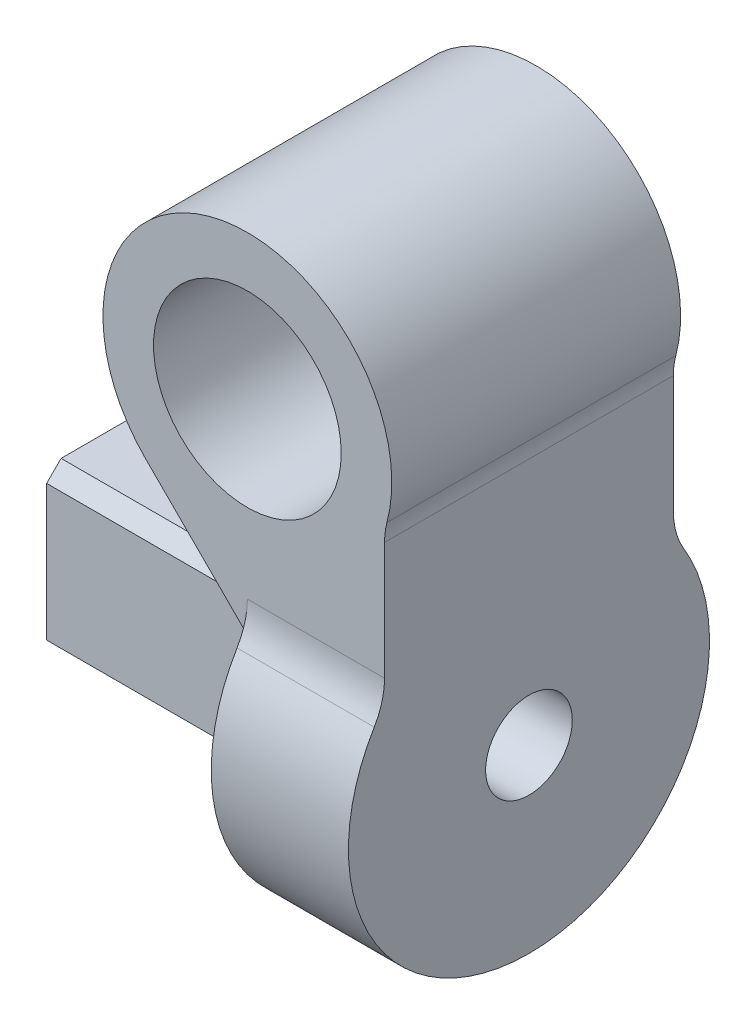
ISO-10303-21;
HEADER;
FILE_DESCRIPTION(('STEP AP214'),'2;1');
FILE_NAME('part.step','',(''),(''),'','','');
FILE_SCHEMA(('AUTOMOTIVE_DESIGN { 1 0 10303 214 1 1 1 1 }'));
ENDSEC;
DATA;
#1=APPLICATION_CONTEXT('core data for automotive mechanical design processes');
#2=APPLICATION_PROTOCOL_DEFINITION('international standard','automotive_design',2000,#1);
#3=PRODUCT_CONTEXT('',#1,'mechanical');
#4=PRODUCT('Part','Part','',(#3));
#5=PRODUCT_RELATED_PRODUCT_CATEGORY('part','',(#4));
#6=PRODUCT_DEFINITION_FORMATION('','',#4);
#7=PRODUCT_DEFINITION_CONTEXT('part definition',#1,'design');
#8=PRODUCT_DEFINITION('design','',#6,#7);
#9=PRODUCT_DEFINITION_SHAPE('','',#8);
#10=(LENGTH_UNIT() NAMED_UNIT(*) SI_UNIT(.MILLI.,.METRE.));
#11=(NAMED_UNIT(*) PLANE_ANGLE_UNIT() SI_UNIT($,.RADIAN.));
#12=(NAMED_UNIT(*) SI_UNIT($,.STERADIAN.) SOLID_ANGLE_UNIT());
#13=UNCERTAINTY_MEASURE_WITH_UNIT(LENGTH_MEASURE(1.E-05),#10,'distance_accuracy_value','');
#14=(GEOMETRIC_REPRESENTATION_CONTEXT(3) GLOBAL_UNCERTAINTY_ASSIGNED_CONTEXT((#13)) GLOBAL_UNIT_ASSIGNED_CONTEXT((#10,
#11,#12)) REPRESENTATION_CONTEXT('',''));
#15=CARTESIAN_POINT('',(0.,0.,0.));
#16=DIRECTION('',(0.,0.,1.));
#17=DIRECTION('',(1.,0.,0.));
#18=AXIS2_PLACEMENT_3D('',#15,#16,#17);
#19=CARTESIAN_POINT('',(0.,0.,0.));
#20=DIRECTION('',(1.,0.,0.));
#21=DIRECTION('',(0.,0.,-1.));
#22=AXIS2_PLACEMENT_3D('',#19,#20,#21);
#23=PLANE('',#22);
#24=CARTESIAN_POINT('',(0.,0.,0.));
#25=DIRECTION('',(1.,0.,0.));
#26=DIRECTION('',(0.,0.,-1.));
#27=AXIS2_PLACEMENT_3D('',#24,#25,#26);
#28=CIRCLE('',#27,62.5);
#29=CARTESIAN_POINT('',(0.,32.192422102357,53.5714285714286));
#30=VERTEX_POINT('',#29);
#31=CARTESIAN_POINT('',(0.,32.192422102357,-53.5714285714286));
#32=VERTEX_POINT('',#31);
#33=EDGE_CURVE('E197',#30,#32,#28,.T.);
#34=ORIENTED_EDGE('',*,*,#33,.F.);
#35=CARTESIAN_POINT('',(0.,45.0693909432998,75.));
#36=DIRECTION('',(1.,0.,0.));
#37=DIRECTION('',(0.,0.,-1.));
#38=AXIS2_PLACEMENT_3D('',#35,#36,#37);
#39=CIRCLE('',#38,25.);
#40=CARTESIAN_POINT('',(0.,45.0693909432998,50.));
#41=VERTEX_POINT('',#40);
#42=EDGE_CURVE('E237',#30,#41,#39,.T.);
#43=ORIENTED_EDGE('',*,*,#42,.T.);
#44=DIRECTION('',(0.,1.,0.));
#45=VECTOR('',#44,1.);
#46=CARTESIAN_POINT('',(0.,34.2893218813449,50.));
#47=LINE('',#46,#45);
#48=CARTESIAN_POINT('',(0.,34.2893218813449,50.));
#49=VERTEX_POINT('',#48);
#50=EDGE_CURVE('E178',#49,#41,#47,.T.);
#51=ORIENTED_EDGE('',*,*,#50,.F.);
#52=DIRECTION('',(0.,0.,-1.));
#53=VECTOR('',#52,1.);
#54=CARTESIAN_POINT('',(0.,34.2893218813449,50.));
#55=LINE('',#54,#53);
#56=CARTESIAN_POINT('',(0.,34.2893218813449,-50.));
#57=VERTEX_POINT('',#56);
#58=EDGE_CURVE('E175',#49,#57,#55,.T.);
#59=ORIENTED_EDGE('',*,*,#58,.T.);
#60=DIRECTION('',(0.,1.,0.));
#61=VECTOR('',#60,1.);
#62=CARTESIAN_POINT('',(0.,34.2893218813449,-50.));
#63=LINE('',#62,#61);
#64=CARTESIAN_POINT('',(0.,45.0693909432998,-50.));
#65=VERTEX_POINT('',#64);
#66=EDGE_CURVE('E168',#57,#65,#63,.T.);
#67=ORIENTED_EDGE('',*,*,#66,.T.);
#68=CARTESIAN_POINT('',(0.,45.0693909432998,-75.));
#69=DIRECTION('',(1.,0.,0.));
#70=DIRECTION('',(0.,0.,-1.));
#71=AXIS2_PLACEMENT_3D('',#68,#69,#70);
#72=CIRCLE('',#71,25.);
#73=EDGE_CURVE('E231',#65,#32,#72,.T.);
#74=ORIENTED_EDGE('',*,*,#73,.T.);
#75=EDGE_LOOP('',(#34,#43,#51,#59,#67,#74));
#76=FACE_BOUND('',#75,.T.);
#77=DIRECTION('',(0.,1.,0.));
#78=VECTOR('',#77,1.);
#79=CARTESIAN_POINT('',(0.,-28.5,28.5));
#80=LINE('',#79,#78);
#81=CARTESIAN_POINT('',(0.,-23.5,28.5));
#82=VERTEX_POINT('',#81);
#83=CARTESIAN_POINT('',(0.,23.5,28.5));
#84=VERTEX_POINT('',#83);
#85=EDGE_CURVE('E293',#82,#84,#80,.T.);
#86=ORIENTED_EDGE('',*,*,#85,.F.);
#87=DIRECTION('',(0.,0.707106781186546,0.707106781186549));
#88=VECTOR('',#87,1.);
#89=CARTESIAN_POINT('',(0.,-26.0000000000001,25.9999999999999));
#90=LINE('',#89,#88);
#91=CARTESIAN_POINT('',(0.,-28.5,23.5));
#92=VERTEX_POINT('',#91);
#93=EDGE_CURVE('E285',#82,#92,#90,.F.);
#94=ORIENTED_EDGE('',*,*,#93,.T.);
#95=DIRECTION('',(0.,0.,1.));
#96=VECTOR('',#95,1.);
#97=CARTESIAN_POINT('',(0.,-28.5,-28.5));
#98=LINE('',#97,#96);
#99=CARTESIAN_POINT('',(0.,-28.5,-23.5));
#100=VERTEX_POINT('',#99);
#101=EDGE_CURVE('E323',#100,#92,#98,.T.);
#102=ORIENTED_EDGE('',*,*,#101,.F.);
#103=DIRECTION('',(0.,-0.707106781186549,0.707106781186546));
#104=VECTOR('',#103,1.);
#105=CARTESIAN_POINT('',(0.,-25.9999999999999,-26.0000000000001));
#106=LINE('',#105,#104);
#107=CARTESIAN_POINT('',(0.,-23.5,-28.5));
#108=VERTEX_POINT('',#107);
#109=EDGE_CURVE('E288',#100,#108,#106,.F.);
#110=ORIENTED_EDGE('',*,*,#109,.T.);
#111=DIRECTION('',(0.,-1.,0.));
#112=VECTOR('',#111,1.);
#113=CARTESIAN_POINT('',(0.,-28.5,-28.5));
#114=LINE('',#113,#112);
#115=CARTESIAN_POINT('',(0.,23.5,-28.5));
#116=VERTEX_POINT('',#115);
#117=EDGE_CURVE('E331',#116,#108,#114,.T.);
#118=ORIENTED_EDGE('',*,*,#117,.F.);
#119=DIRECTION('',(0.,-0.707106781186546,-0.707106781186549));
#120=VECTOR('',#119,1.);
#121=CARTESIAN_POINT('',(0.,26.0000000000001,-25.9999999999999));
#122=LINE('',#121,#120);
#123=CARTESIAN_POINT('',(0.,28.5,-23.5));
#124=VERTEX_POINT('',#123);
#125=EDGE_CURVE('E11',#116,#124,#122,.F.);
#126=ORIENTED_EDGE('',*,*,#125,.T.);
#127=DIRECTION('',(0.,0.,-1.));
#128=VECTOR('',#127,1.);
#129=CARTESIAN_POINT('',(0.,28.5,-28.5));
#130=LINE('',#129,#128);
#131=CARTESIAN_POINT('',(0.,28.5,23.5));
#132=VERTEX_POINT('',#131);
#133=EDGE_CURVE('E294',#132,#124,#130,.T.);
#134=ORIENTED_EDGE('',*,*,#133,.F.);
#135=DIRECTION('',(0.,0.707106781186549,-0.707106781186546));
#136=VECTOR('',#135,1.);
#137=CARTESIAN_POINT('',(0.,25.9999999999999,26.0000000000001));
#138=LINE('',#137,#136);
#139=EDGE_CURVE('E53',#132,#84,#138,.F.);
#140=ORIENTED_EDGE('',*,*,#139,.T.);
#141=EDGE_LOOP('',(#86,#94,#102,#110,#118,#126,#134,#140));
#142=FACE_BOUND('',#141,.T.);
#143=ADVANCED_FACE('F43',(#76,#142),#23,.F.);
#144=CARTESIAN_POINT('',(47.5,0.,0.));
#145=DIRECTION('',(-1.,0.,0.));
#146=DIRECTION('',(0.,0.,1.));
#147=AXIS2_PLACEMENT_3D('',#144,#145,#146);
#148=CYLINDRICAL_SURFACE('',#147,62.5);
#149=ORIENTED_EDGE('',*,*,#33,.T.);
#150=DIRECTION('',(-1.,0.,0.));
#151=VECTOR('',#150,1.);
#152=CARTESIAN_POINT('',(47.5,32.192422102357,-53.5714285714286));
#153=LINE('',#152,#151);
#154=CARTESIAN_POINT('',(47.5,32.192422102357,-53.5714285714286));
#155=VERTEX_POINT('',#154);
#156=EDGE_CURVE('E209',#32,#155,#153,.F.);
#157=ORIENTED_EDGE('',*,*,#156,.T.);
#158=CARTESIAN_POINT('',(47.5,0.,0.));
#159=DIRECTION('',(1.,0.,0.));
#160=DIRECTION('',(0.,0.,-1.));
#161=AXIS2_PLACEMENT_3D('',#158,#159,#160);
#162=CIRCLE('',#161,62.5);
#163=CARTESIAN_POINT('',(47.5,32.192422102357,53.5714285714286));
#164=VERTEX_POINT('',#163);
#165=EDGE_CURVE('E199',#164,#155,#162,.T.);
#166=ORIENTED_EDGE('',*,*,#165,.F.);
#167=DIRECTION('',(-1.,0.,0.));
#168=VECTOR('',#167,1.);
#169=CARTESIAN_POINT('',(47.5,32.192422102357,53.5714285714286));
#170=LINE('',#169,#168);
#171=EDGE_CURVE('E203',#164,#30,#170,.T.);
#172=ORIENTED_EDGE('',*,*,#171,.T.);
#173=EDGE_LOOP('',(#149,#157,#166,#172));
#174=FACE_BOUND('',#173,.T.);
#175=ADVANCED_FACE('F374',(#174),#148,.T.);
#176=CARTESIAN_POINT('',(47.5,0.,0.));
#177=DIRECTION('',(1.,0.,0.));
#178=DIRECTION('',(0.,0.,-1.));
#179=AXIS2_PLACEMENT_3D('',#176,#177,#178);
#180=PLANE('',#179);
#181=DIRECTION('',(0.,1.,0.));
#182=VECTOR('',#181,1.);
#183=CARTESIAN_POINT('',(47.5,62.5,-50.));
#184=LINE('',#183,#182);
#185=CARTESIAN_POINT('',(47.5,45.0693909432998,-50.));
#186=VERTEX_POINT('',#185);
#187=CARTESIAN_POINT('',(47.5,85.7971356303285,-50.));
#188=VERTEX_POINT('',#187);
#189=EDGE_CURVE('E341',#186,#188,#184,.T.);
#190=ORIENTED_EDGE('',*,*,#189,.T.);
#191=DIRECTION('',(0.,0.,-1.));
#192=VECTOR('',#191,1.);
#193=CARTESIAN_POINT('',(47.5,85.7971356303285,0.));
#194=LINE('',#193,#192);
#195=CARTESIAN_POINT('',(47.5,85.7971356303285,50.));
#196=VERTEX_POINT('',#195);
#197=EDGE_CURVE('E221',#188,#196,#194,.F.);
#198=ORIENTED_EDGE('',*,*,#197,.T.);
#199=DIRECTION('',(0.,-1.,0.));
#200=VECTOR('',#199,1.);
#201=CARTESIAN_POINT('',(47.5,55.,50.));
#202=LINE('',#201,#200);
#203=CARTESIAN_POINT('',(47.5,45.0693909432998,50.));
#204=VERTEX_POINT('',#203);
#205=EDGE_CURVE('E327',#196,#204,#202,.T.);
#206=ORIENTED_EDGE('',*,*,#205,.T.);
#207=CARTESIAN_POINT('',(47.5,45.0693909432998,75.));
#208=DIRECTION('',(1.,0.,0.));
#209=DIRECTION('',(0.,0.,-1.));
#210=AXIS2_PLACEMENT_3D('',#207,#208,#209);
#211=CIRCLE('',#210,25.);
#212=EDGE_CURVE('E234',#204,#164,#211,.F.);
#213=ORIENTED_EDGE('',*,*,#212,.T.);
#214=ORIENTED_EDGE('',*,*,#165,.T.);
#215=CARTESIAN_POINT('',(47.5,45.0693909432998,-75.));
#216=DIRECTION('',(1.,0.,0.));
#217=DIRECTION('',(0.,0.,-1.));
#218=AXIS2_PLACEMENT_3D('',#215,#216,#217);
#219=CIRCLE('',#218,25.);
#220=EDGE_CURVE('E228',#155,#186,#219,.F.);
#221=ORIENTED_EDGE('',*,*,#220,.T.);
#222=EDGE_LOOP('',(#190,#198,#206,#213,#214,#221));
#223=FACE_BOUND('',#222,.T.);
#224=CARTESIAN_POINT('',(47.5,0.,0.));
#225=DIRECTION('',(1.,0.,0.));
#226=DIRECTION('',(0.,0.,-1.));
#227=AXIS2_PLACEMENT_3D('',#224,#225,#226);
#228=CIRCLE('',#227,15.);
#229=CARTESIAN_POINT('',(47.5,0.,-15.));
#230=VERTEX_POINT('',#229);
#231=EDGE_CURVE('E190',#230,#230,#228,.T.);
#232=ORIENTED_EDGE('',*,*,#231,.F.);
#233=EDGE_LOOP('',(#232));
#234=FACE_BOUND('',#233,.T.);
#235=ADVANCED_FACE('F377',(#223,#234),#180,.T.);
#236=CARTESIAN_POINT('',(47.5,0.,0.));
#237=DIRECTION('',(-1.,0.,0.));
#238=DIRECTION('',(0.,0.,1.));
#239=AXIS2_PLACEMENT_3D('',#236,#237,#238);
#240=CYLINDRICAL_SURFACE('',#239,15.);
#241=ORIENTED_EDGE('',*,*,#231,.T.);
#242=EDGE_LOOP('',(#241));
#243=FACE_BOUND('',#242,.T.);
#244=CARTESIAN_POINT('',(0.,0.,0.));
#245=DIRECTION('',(1.,0.,0.));
#246=DIRECTION('',(0.,0.,-1.));
#247=AXIS2_PLACEMENT_3D('',#244,#245,#246);
#248=CIRCLE('',#247,15.);
#249=CARTESIAN_POINT('',(0.,0.,-15.));
#250=VERTEX_POINT('',#249);
#251=EDGE_CURVE('E185',#250,#250,#248,.T.);
#252=ORIENTED_EDGE('',*,*,#251,.F.);
#253=EDGE_LOOP('',(#252));
#254=FACE_BOUND('',#253,.T.);
#255=ADVANCED_FACE('F406',(#243,#254),#240,.F.);
#256=CARTESIAN_POINT('',(0.,105.,50.));
#257=DIRECTION('',(0.,0.,-1.));
#258=DIRECTION('',(-1.,0.,0.));
#259=AXIS2_PLACEMENT_3D('',#256,#257,#258);
#260=CYLINDRICAL_SURFACE('',#259,50.);
#261=CARTESIAN_POINT('',(0.,105.,50.));
#262=DIRECTION('',(0.,0.,1.));
#263=DIRECTION('',(1.,0.,0.));
#264=AXIS2_PLACEMENT_3D('',#261,#262,#263);
#265=CIRCLE('',#264,50.);
#266=CARTESIAN_POINT('',(48.3333333333333,92.198090420219,50.));
#267=VERTEX_POINT('',#266);
#268=CARTESIAN_POINT('',(-35.3553390593276,69.6446609406728,50.));
#269=VERTEX_POINT('',#268);
#270=EDGE_CURVE('E156',#267,#269,#265,.T.);
#271=ORIENTED_EDGE('',*,*,#270,.F.);
#272=DIRECTION('',(0.,0.,-1.));
#273=VECTOR('',#272,1.);
#274=CARTESIAN_POINT('',(48.3333333333333,92.198090420219,50.));
#275=LINE('',#274,#273);
#276=CARTESIAN_POINT('',(48.3333333333333,92.198090420219,-50.));
#277=VERTEX_POINT('',#276);
#278=EDGE_CURVE('E225',#267,#277,#275,.T.);
#279=ORIENTED_EDGE('',*,*,#278,.T.);
#280=CARTESIAN_POINT('',(0.,105.,-50.));
#281=DIRECTION('',(0.,0.,1.));
#282=DIRECTION('',(1.,0.,0.));
#283=AXIS2_PLACEMENT_3D('',#280,#281,#282);
#284=CIRCLE('',#283,50.);
#285=CARTESIAN_POINT('',(-35.3553390593276,69.6446609406728,-50.));
#286=VERTEX_POINT('',#285);
#287=EDGE_CURVE('E182',#277,#286,#284,.T.);
#288=ORIENTED_EDGE('',*,*,#287,.T.);
#289=DIRECTION('',(0.,0.,-1.));
#290=VECTOR('',#289,1.);
#291=CARTESIAN_POINT('',(-35.3553390593276,69.6446609406728,50.));
#292=LINE('',#291,#290);
#293=EDGE_CURVE('E173',#269,#286,#292,.T.);
#294=ORIENTED_EDGE('',*,*,#293,.F.);
#295=EDGE_LOOP('',(#271,#279,#288,#294));
#296=FACE_BOUND('',#295,.T.);
#297=ADVANCED_FACE('F180',(#296),#260,.T.);
#298=CARTESIAN_POINT('',(0.,105.,50.));
#299=DIRECTION('',(0.,0.,1.));
#300=DIRECTION('',(1.,0.,0.));
#301=AXIS2_PLACEMENT_3D('',#298,#299,#300);
#302=PLANE('',#301);
#303=ORIENTED_EDGE('',*,*,#50,.T.);
#304=DIRECTION('',(-1.,0.,0.));
#305=VECTOR('',#304,1.);
#306=CARTESIAN_POINT('',(0.,45.0693909432998,50.));
#307=LINE('',#306,#305);
#308=EDGE_CURVE('E217',#41,#204,#307,.F.);
#309=ORIENTED_EDGE('',*,*,#308,.T.);
#310=ORIENTED_EDGE('',*,*,#205,.F.);
#311=CARTESIAN_POINT('',(72.5,85.7971356303285,50.));
#312=DIRECTION('',(0.,0.,1.));
#313=DIRECTION('',(1.,0.,0.));
#314=AXIS2_PLACEMENT_3D('',#311,#312,#313);
#315=CIRCLE('',#314,25.);
#316=EDGE_CURVE('E163',#196,#267,#315,.F.);
#317=ORIENTED_EDGE('',*,*,#316,.T.);
#318=ORIENTED_EDGE('',*,*,#270,.T.);
#319=DIRECTION('',(0.707106781186544,-0.707106781186551,0.));
#320=VECTOR('',#319,1.);
#321=CARTESIAN_POINT('',(-35.3553390593276,69.6446609406728,50.));
#322=LINE('',#321,#320);
#323=EDGE_CURVE('E160',#269,#49,#322,.T.);
#324=ORIENTED_EDGE('',*,*,#323,.T.);
#325=EDGE_LOOP('',(#303,#309,#310,#317,#318,#324));
#326=FACE_BOUND('',#325,.T.);
#327=CARTESIAN_POINT('',(0.,105.,50.));
#328=DIRECTION('',(0.,0.,1.));
#329=DIRECTION('',(1.,0.,0.));
#330=AXIS2_PLACEMENT_3D('',#327,#328,#329);
#331=CIRCLE('',#330,32.5);
#332=CARTESIAN_POINT('',(32.5,105.,50.));
#333=VERTEX_POINT('',#332);
#334=EDGE_CURVE('E346',#333,#333,#331,.T.);
#335=ORIENTED_EDGE('',*,*,#334,.F.);
#336=EDGE_LOOP('',(#335));
#337=FACE_BOUND('',#336,.T.);
#338=ADVANCED_FACE('F158',(#326,#337),#302,.T.);
#339=CARTESIAN_POINT('',(0.,105.,-50.));
#340=DIRECTION('',(0.,0.,1.));
#341=DIRECTION('',(1.,0.,0.));
#342=AXIS2_PLACEMENT_3D('',#339,#340,#341);
#343=PLANE('',#342);
#344=ORIENTED_EDGE('',*,*,#189,.F.);
#345=DIRECTION('',(1.,0.,0.));
#346=VECTOR('',#345,1.);
#347=CARTESIAN_POINT('',(0.,45.0693909432998,-50.));
#348=LINE('',#347,#346);
#349=EDGE_CURVE('E213',#186,#65,#348,.F.);
#350=ORIENTED_EDGE('',*,*,#349,.T.);
#351=ORIENTED_EDGE('',*,*,#66,.F.);
#352=DIRECTION('',(0.707106781186544,-0.707106781186551,0.));
#353=VECTOR('',#352,1.);
#354=CARTESIAN_POINT('',(-35.3553390593276,69.6446609406728,-50.));
#355=LINE('',#354,#353);
#356=EDGE_CURVE('E357',#286,#57,#355,.T.);
#357=ORIENTED_EDGE('',*,*,#356,.F.);
#358=ORIENTED_EDGE('',*,*,#287,.F.);
#359=CARTESIAN_POINT('',(72.5,85.7971356303285,-50.));
#360=DIRECTION('',(0.,0.,1.));
#361=DIRECTION('',(1.,0.,0.));
#362=AXIS2_PLACEMENT_3D('',#359,#360,#361);
#363=CIRCLE('',#362,25.);
#364=EDGE_CURVE('E243',#277,#188,#363,.T.);
#365=ORIENTED_EDGE('',*,*,#364,.T.);
#366=EDGE_LOOP('',(#344,#350,#351,#357,#358,#365));
#367=FACE_BOUND('',#366,.T.);
#368=CARTESIAN_POINT('',(0.,105.,-50.));
#369=DIRECTION('',(0.,0.,1.));
#370=DIRECTION('',(1.,0.,0.));
#371=AXIS2_PLACEMENT_3D('',#368,#369,#370);
#372=CIRCLE('',#371,32.5);
#373=CARTESIAN_POINT('',(32.5,105.,-50.));
#374=VERTEX_POINT('',#373);
#375=EDGE_CURVE('E345',#374,#374,#372,.T.);
#376=ORIENTED_EDGE('',*,*,#375,.T.);
#377=EDGE_LOOP('',(#376));
#378=FACE_BOUND('',#377,.T.);
#379=ADVANCED_FACE('F367',(#367,#378),#343,.F.);
#380=CARTESIAN_POINT('',(-35.3553390593276,69.6446609406728,50.));
#381=DIRECTION('',(0.707106781186551,0.707106781186544,0.));
#382=DIRECTION('',(-0.707106781186544,0.707106781186551,0.));
#383=AXIS2_PLACEMENT_3D('',#380,#381,#382);
#384=PLANE('',#383);
#385=ORIENTED_EDGE('',*,*,#356,.T.);
#386=ORIENTED_EDGE('',*,*,#58,.F.);
#387=ORIENTED_EDGE('',*,*,#323,.F.);
#388=ORIENTED_EDGE('',*,*,#293,.T.);
#389=EDGE_LOOP('',(#385,#386,#387,#388));
#390=FACE_BOUND('',#389,.T.);
#391=ADVANCED_FACE('F172',(#390),#384,.F.);
#392=CARTESIAN_POINT('',(0.,105.,50.));
#393=DIRECTION('',(0.,0.,-1.));
#394=DIRECTION('',(-1.,0.,0.));
#395=AXIS2_PLACEMENT_3D('',#392,#393,#394);
#396=CYLINDRICAL_SURFACE('',#395,32.5);
#397=ORIENTED_EDGE('',*,*,#334,.T.);
#398=EDGE_LOOP('',(#397));
#399=FACE_BOUND('',#398,.T.);
#400=ORIENTED_EDGE('',*,*,#375,.F.);
#401=EDGE_LOOP('',(#400));
#402=FACE_BOUND('',#401,.T.);
#403=ADVANCED_FACE('F393',(#399,#402),#396,.F.);
#404=CARTESIAN_POINT('',(47.5,45.0693909432998,-75.));
#405=DIRECTION('',(-1.,0.,0.));
#406=DIRECTION('',(0.,0.,1.));
#407=AXIS2_PLACEMENT_3D('',#404,#405,#406);
#408=CYLINDRICAL_SURFACE('',#407,25.);
#409=ORIENTED_EDGE('',*,*,#73,.F.);
#410=ORIENTED_EDGE('',*,*,#349,.F.);
#411=ORIENTED_EDGE('',*,*,#220,.F.);
#412=ORIENTED_EDGE('',*,*,#156,.F.);
#413=EDGE_LOOP('',(#409,#410,#411,#412));
#414=FACE_BOUND('',#413,.T.);
#415=ADVANCED_FACE('F371',(#414),#408,.F.);
#416=CARTESIAN_POINT('',(47.5,45.0693909432998,75.));
#417=DIRECTION('',(-1.,0.,0.));
#418=DIRECTION('',(0.,0.,1.));
#419=AXIS2_PLACEMENT_3D('',#416,#417,#418);
#420=CYLINDRICAL_SURFACE('',#419,25.);
#421=ORIENTED_EDGE('',*,*,#42,.F.);
#422=ORIENTED_EDGE('',*,*,#171,.F.);
#423=ORIENTED_EDGE('',*,*,#212,.F.);
#424=ORIENTED_EDGE('',*,*,#308,.F.);
#425=EDGE_LOOP('',(#421,#422,#423,#424));
#426=FACE_BOUND('',#425,.T.);
#427=ADVANCED_FACE('F382',(#426),#420,.F.);
#428=CARTESIAN_POINT('',(72.5,85.7971356303285,50.));
#429=DIRECTION('',(0.,0.,-1.));
#430=DIRECTION('',(-1.,0.,0.));
#431=AXIS2_PLACEMENT_3D('',#428,#429,#430);
#432=CYLINDRICAL_SURFACE('',#431,25.);
#433=ORIENTED_EDGE('',*,*,#364,.F.);
#434=ORIENTED_EDGE('',*,*,#278,.F.);
#435=ORIENTED_EDGE('',*,*,#316,.F.);
#436=ORIENTED_EDGE('',*,*,#197,.F.);
#437=EDGE_LOOP('',(#433,#434,#435,#436));
#438=FACE_BOUND('',#437,.T.);
#439=ADVANCED_FACE('F384',(#438),#432,.F.);
#440=CARTESIAN_POINT('',(0.,0.,0.));
#441=DIRECTION('',(1.,0.,0.));
#442=DIRECTION('',(0.,0.,-1.));
#443=AXIS2_PLACEMENT_3D('',#440,#441,#442);
#444=PLANE('',#443);
#445=ORIENTED_EDGE('',*,*,#251,.T.);
#446=EDGE_LOOP('',(#445));
#447=FACE_BOUND('',#446,.T.);
#448=ADVANCED_FACE('F390',(#447),#444,.T.);
#449=CARTESIAN_POINT('',(-91.,-28.5,28.5));
#450=DIRECTION('',(0.,0.,-1.));
#451=DIRECTION('',(-1.,0.,0.));
#452=AXIS2_PLACEMENT_3D('',#449,#450,#451);
#453=PLANE('',#452);
#454=DIRECTION('',(0.,1.,0.));
#455=VECTOR('',#454,1.);
#456=CARTESIAN_POINT('',(-91.,-28.5,28.5));
#457=LINE('',#456,#455);
#458=CARTESIAN_POINT('',(-91.,-23.5,28.5));
#459=VERTEX_POINT('',#458);
#460=CARTESIAN_POINT('',(-91.,23.5,28.5));
#461=VERTEX_POINT('',#460);
#462=EDGE_CURVE('E311',#459,#461,#457,.T.);
#463=ORIENTED_EDGE('',*,*,#462,.F.);
#464=DIRECTION('',(1.,0.,0.));
#465=VECTOR('',#464,1.);
#466=CARTESIAN_POINT('',(-91.,-23.5,28.5));
#467=LINE('',#466,#465);
#468=EDGE_CURVE('E249',#459,#82,#467,.T.);
#469=ORIENTED_EDGE('',*,*,#468,.T.);
#470=ORIENTED_EDGE('',*,*,#85,.T.);
#471=DIRECTION('',(-1.,0.,0.));
#472=VECTOR('',#471,1.);
#473=CARTESIAN_POINT('',(-91.,23.5,28.5));
#474=LINE('',#473,#472);
#475=EDGE_CURVE('E246',#84,#461,#474,.T.);
#476=ORIENTED_EDGE('',*,*,#475,.T.);
#477=EDGE_LOOP('',(#463,#469,#470,#476));
#478=FACE_BOUND('',#477,.T.);
#479=ADVANCED_FACE('F297',(#478),#453,.F.);
#480=CARTESIAN_POINT('',(-91.,28.5,-28.5));
#481=DIRECTION('',(0.,-1.,0.));
#482=DIRECTION('',(0.,0.,-1.));
#483=AXIS2_PLACEMENT_3D('',#480,#481,#482);
#484=PLANE('',#483);
#485=DIRECTION('',(0.,0.,-1.));
#486=VECTOR('',#485,1.);
#487=CARTESIAN_POINT('',(-91.,28.5,-28.5));
#488=LINE('',#487,#486);
#489=CARTESIAN_POINT('',(-91.,28.5,23.5));
#490=VERTEX_POINT('',#489);
#491=CARTESIAN_POINT('',(-91.,28.5,-23.5));
#492=VERTEX_POINT('',#491);
#493=EDGE_CURVE('E309',#490,#492,#488,.T.);
#494=ORIENTED_EDGE('',*,*,#493,.F.);
#495=DIRECTION('',(1.,0.,0.));
#496=VECTOR('',#495,1.);
#497=CARTESIAN_POINT('',(-91.,28.5,23.5));
#498=LINE('',#497,#496);
#499=EDGE_CURVE('E282',#490,#132,#498,.T.);
#500=ORIENTED_EDGE('',*,*,#499,.T.);
#501=ORIENTED_EDGE('',*,*,#133,.T.);
#502=DIRECTION('',(-1.,0.,0.));
#503=VECTOR('',#502,1.);
#504=CARTESIAN_POINT('',(-91.,28.5,-23.5));
#505=LINE('',#504,#503);
#506=EDGE_CURVE('E279',#124,#492,#505,.T.);
#507=ORIENTED_EDGE('',*,*,#506,.T.);
#508=EDGE_LOOP('',(#494,#500,#501,#507));
#509=FACE_BOUND('',#508,.T.);
#510=ADVANCED_FACE('F313',(#509),#484,.F.);
#511=CARTESIAN_POINT('',(-91.,-28.5,-28.5));
#512=DIRECTION('',(0.,0.,1.));
#513=DIRECTION('',(1.,0.,0.));
#514=AXIS2_PLACEMENT_3D('',#511,#512,#513);
#515=PLANE('',#514);
#516=ORIENTED_EDGE('',*,*,#117,.T.);
#517=DIRECTION('',(-1.,0.,0.));
#518=VECTOR('',#517,1.);
#519=CARTESIAN_POINT('',(-91.,-23.5,-28.5));
#520=LINE('',#519,#518);
#521=CARTESIAN_POINT('',(-91.,-23.5,-28.5));
#522=VERTEX_POINT('',#521);
#523=EDGE_CURVE('E276',#108,#522,#520,.T.);
#524=ORIENTED_EDGE('',*,*,#523,.T.);
#525=DIRECTION('',(0.,-1.,0.));
#526=VECTOR('',#525,1.);
#527=CARTESIAN_POINT('',(-91.,-28.5,-28.5));
#528=LINE('',#527,#526);
#529=CARTESIAN_POINT('',(-91.,23.5,-28.5));
#530=VERTEX_POINT('',#529);
#531=EDGE_CURVE('E316',#530,#522,#528,.T.);
#532=ORIENTED_EDGE('',*,*,#531,.F.);
#533=DIRECTION('',(1.,0.,0.));
#534=VECTOR('',#533,1.);
#535=CARTESIAN_POINT('',(-91.,23.5,-28.5));
#536=LINE('',#535,#534);
#537=EDGE_CURVE('E272',#530,#116,#536,.T.);
#538=ORIENTED_EDGE('',*,*,#537,.T.);
#539=EDGE_LOOP('',(#516,#524,#532,#538));
#540=FACE_BOUND('',#539,.T.);
#541=ADVANCED_FACE('F425',(#540),#515,.F.);
#542=CARTESIAN_POINT('',(-91.,-28.5,-28.5));
#543=DIRECTION('',(0.,1.,0.));
#544=DIRECTION('',(0.,0.,1.));
#545=AXIS2_PLACEMENT_3D('',#542,#543,#544);
#546=PLANE('',#545);
#547=ORIENTED_EDGE('',*,*,#101,.T.);
#548=DIRECTION('',(-1.,0.,0.));
#549=VECTOR('',#548,1.);
#550=CARTESIAN_POINT('',(-91.,-28.5,23.5));
#551=LINE('',#550,#549);
#552=CARTESIAN_POINT('',(-91.,-28.5,23.5));
#553=VERTEX_POINT('',#552);
#554=EDGE_CURVE('E257',#92,#553,#551,.T.);
#555=ORIENTED_EDGE('',*,*,#554,.T.);
#556=DIRECTION('',(0.,0.,1.));
#557=VECTOR('',#556,1.);
#558=CARTESIAN_POINT('',(-91.,-28.5,-28.5));
#559=LINE('',#558,#557);
#560=CARTESIAN_POINT('',(-91.,-28.5,-23.5));
#561=VERTEX_POINT('',#560);
#562=EDGE_CURVE('E321',#561,#553,#559,.T.);
#563=ORIENTED_EDGE('',*,*,#562,.F.);
#564=DIRECTION('',(1.,0.,0.));
#565=VECTOR('',#564,1.);
#566=CARTESIAN_POINT('',(-91.,-28.5,-23.5));
#567=LINE('',#566,#565);
#568=EDGE_CURVE('E253',#561,#100,#567,.T.);
#569=ORIENTED_EDGE('',*,*,#568,.T.);
#570=EDGE_LOOP('',(#547,#555,#563,#569));
#571=FACE_BOUND('',#570,.T.);
#572=ADVANCED_FACE('F428',(#571),#546,.F.);
#573=CARTESIAN_POINT('',(-91.,0.,0.));
#574=DIRECTION('',(1.,0.,0.));
#575=DIRECTION('',(0.,0.,-1.));
#576=AXIS2_PLACEMENT_3D('',#573,#574,#575);
#577=PLANE('',#576);
#578=ORIENTED_EDGE('',*,*,#562,.T.);
#579=DIRECTION('',(0.,-0.707106781186546,-0.707106781186549));
#580=VECTOR('',#579,1.);
#581=CARTESIAN_POINT('',(-91.,-23.5,28.5));
#582=LINE('',#581,#580);
#583=EDGE_CURVE('E269',#553,#459,#582,.F.);
#584=ORIENTED_EDGE('',*,*,#583,.T.);
#585=ORIENTED_EDGE('',*,*,#462,.T.);
#586=DIRECTION('',(0.,-0.707106781186549,0.707106781186546));
#587=VECTOR('',#586,1.);
#588=CARTESIAN_POINT('',(-91.,28.5,23.5));
#589=LINE('',#588,#587);
#590=EDGE_CURVE('E263',#461,#490,#589,.F.);
#591=ORIENTED_EDGE('',*,*,#590,.T.);
#592=ORIENTED_EDGE('',*,*,#493,.T.);
#593=DIRECTION('',(0.,0.707106781186546,0.707106781186549));
#594=VECTOR('',#593,1.);
#595=CARTESIAN_POINT('',(-91.,23.5,-28.5));
#596=LINE('',#595,#594);
#597=EDGE_CURVE('E260',#492,#530,#596,.F.);
#598=ORIENTED_EDGE('',*,*,#597,.T.);
#599=ORIENTED_EDGE('',*,*,#531,.T.);
#600=DIRECTION('',(0.,0.707106781186549,-0.707106781186546));
#601=VECTOR('',#600,1.);
#602=CARTESIAN_POINT('',(-91.,-28.5,-23.5));
#603=LINE('',#602,#601);
#604=EDGE_CURVE('E266',#522,#561,#603,.F.);
#605=ORIENTED_EDGE('',*,*,#604,.T.);
#606=EDGE_LOOP('',(#578,#584,#585,#591,#592,#598,#599,#605));
#607=FACE_BOUND('',#606,.T.);
#608=ADVANCED_FACE('F308',(#607),#577,.F.);
#609=CARTESIAN_POINT('',(-91.,-23.5,28.5));
#610=DIRECTION('',(0.,0.707106781186549,-0.707106781186546));
#611=DIRECTION('',(1.,0.,0.));
#612=AXIS2_PLACEMENT_3D('',#609,#610,#611);
#613=PLANE('',#612);
#614=ORIENTED_EDGE('',*,*,#583,.F.);
#615=ORIENTED_EDGE('',*,*,#554,.F.);
#616=ORIENTED_EDGE('',*,*,#93,.F.);
#617=ORIENTED_EDGE('',*,*,#468,.F.);
#618=EDGE_LOOP('',(#614,#615,#616,#617));
#619=FACE_BOUND('',#618,.T.);
#620=ADVANCED_FACE('F437',(#619),#613,.F.);
#621=CARTESIAN_POINT('',(-91.,-28.5,-23.5));
#622=DIRECTION('',(0.,0.707106781186546,0.707106781186549));
#623=DIRECTION('',(1.,0.,0.));
#624=AXIS2_PLACEMENT_3D('',#621,#622,#623);
#625=PLANE('',#624);
#626=ORIENTED_EDGE('',*,*,#604,.F.);
#627=ORIENTED_EDGE('',*,*,#523,.F.);
#628=ORIENTED_EDGE('',*,*,#109,.F.);
#629=ORIENTED_EDGE('',*,*,#568,.F.);
#630=EDGE_LOOP('',(#626,#627,#628,#629));
#631=FACE_BOUND('',#630,.T.);
#632=ADVANCED_FACE('F441',(#631),#625,.F.);
#633=CARTESIAN_POINT('',(-91.,28.5,23.5));
#634=DIRECTION('',(0.,-0.707106781186545,-0.707106781186549));
#635=DIRECTION('',(1.,0.,0.));
#636=AXIS2_PLACEMENT_3D('',#633,#634,#635);
#637=PLANE('',#636);
#638=ORIENTED_EDGE('',*,*,#590,.F.);
#639=ORIENTED_EDGE('',*,*,#475,.F.);
#640=ORIENTED_EDGE('',*,*,#139,.F.);
#641=ORIENTED_EDGE('',*,*,#499,.F.);
#642=EDGE_LOOP('',(#638,#639,#640,#641));
#643=FACE_BOUND('',#642,.T.);
#644=ADVANCED_FACE('F303',(#643),#637,.F.);
#645=CARTESIAN_POINT('',(-91.,23.5,-28.5));
#646=DIRECTION('',(0.,-0.707106781186549,0.707106781186545));
#647=DIRECTION('',(1.,0.,0.));
#648=AXIS2_PLACEMENT_3D('',#645,#646,#647);
#649=PLANE('',#648);
#650=ORIENTED_EDGE('',*,*,#597,.F.);
#651=ORIENTED_EDGE('',*,*,#506,.F.);
#652=ORIENTED_EDGE('',*,*,#125,.F.);
#653=ORIENTED_EDGE('',*,*,#537,.F.);
#654=EDGE_LOOP('',(#650,#651,#652,#653));
#655=FACE_BOUND('',#654,.T.);
#656=ADVANCED_FACE('F46',(#655),#649,.F.);
#657=CLOSED_SHELL('',(#143,#175,#235,#255,#297,#338,#379,#391,#403,#415,#427,#439,#448,#479,
#510,#541,#572,#608,#620,#632,#644,#656));
#658=MANIFOLD_SOLID_BREP('B2',#657);
#659=ADVANCED_BREP_SHAPE_REPRESENTATION('',(#18,#658),#14);
#660=SHAPE_DEFINITION_REPRESENTATION(#9,#659);
ENDSEC;
END-ISO-10303-21;
